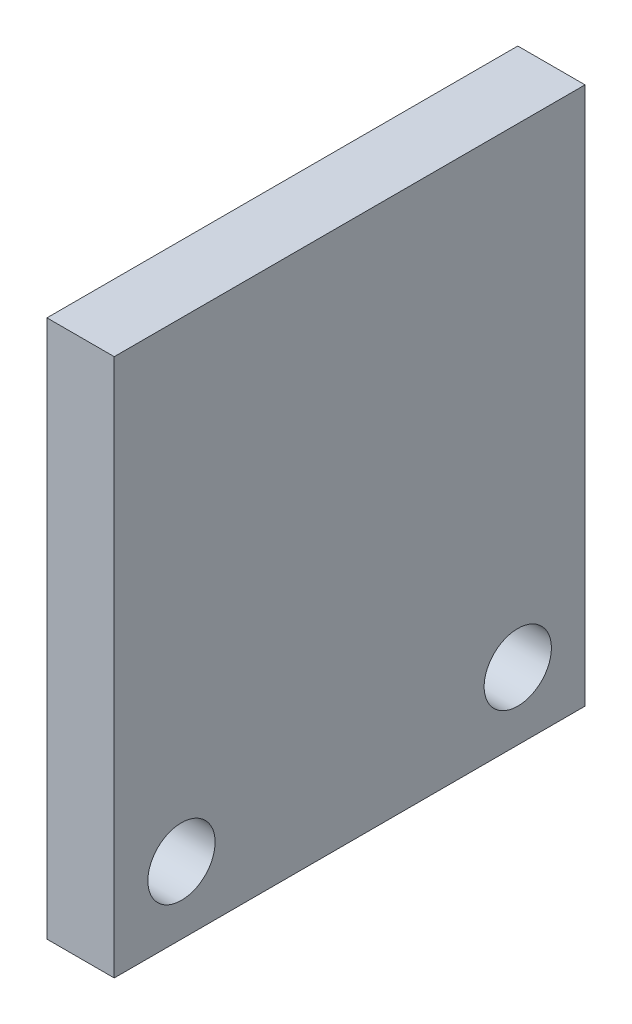
ISO-10303-21;
HEADER;
FILE_DESCRIPTION(('STEP AP214'),'2;1');
FILE_NAME('part.step','',(''),(''),'','','');
FILE_SCHEMA(('AUTOMOTIVE_DESIGN { 1 0 10303 214 1 1 1 1 }'));
ENDSEC;
DATA;
#1=APPLICATION_CONTEXT('core data for automotive mechanical design processes');
#2=APPLICATION_PROTOCOL_DEFINITION('international standard','automotive_design',2000,#1);
#3=PRODUCT_CONTEXT('',#1,'mechanical');
#4=PRODUCT('Part','Part','',(#3));
#5=PRODUCT_RELATED_PRODUCT_CATEGORY('part','',(#4));
#6=PRODUCT_DEFINITION_FORMATION('','',#4);
#7=PRODUCT_DEFINITION_CONTEXT('part definition',#1,'design');
#8=PRODUCT_DEFINITION('design','',#6,#7);
#9=PRODUCT_DEFINITION_SHAPE('','',#8);
#10=(LENGTH_UNIT() NAMED_UNIT(*) SI_UNIT(.MILLI.,.METRE.));
#11=(NAMED_UNIT(*) PLANE_ANGLE_UNIT() SI_UNIT($,.RADIAN.));
#12=(NAMED_UNIT(*) SI_UNIT($,.STERADIAN.) SOLID_ANGLE_UNIT());
#13=UNCERTAINTY_MEASURE_WITH_UNIT(LENGTH_MEASURE(1.E-05),#10,'distance_accuracy_value','');
#14=(GEOMETRIC_REPRESENTATION_CONTEXT(3) GLOBAL_UNCERTAINTY_ASSIGNED_CONTEXT((#13)) GLOBAL_UNIT_ASSIGNED_CONTEXT((#10,
#11,#12)) REPRESENTATION_CONTEXT('',''));
#15=CARTESIAN_POINT('',(0.,0.,0.));
#16=DIRECTION('',(0.,0.,1.));
#17=DIRECTION('',(1.,0.,0.));
#18=AXIS2_PLACEMENT_3D('',#15,#16,#17);
#19=CARTESIAN_POINT('',(5.,20.,-17.5));
#20=DIRECTION('',(0.,0.,1.));
#21=DIRECTION('',(0.,-1.,0.));
#22=AXIS2_PLACEMENT_3D('',#19,#20,#21);
#23=PLANE('',#22);
#24=DIRECTION('',(0.,1.,0.));
#25=VECTOR('',#24,1.);
#26=CARTESIAN_POINT('',(0.,20.,-17.5));
#27=LINE('',#26,#25);
#28=CARTESIAN_POINT('',(0.,-20.,-17.5));
#29=VERTEX_POINT('',#28);
#30=CARTESIAN_POINT('',(0.,20.,-17.5));
#31=VERTEX_POINT('',#30);
#32=EDGE_CURVE('E107',#29,#31,#27,.T.);
#33=ORIENTED_EDGE('',*,*,#32,.T.);
#34=DIRECTION('',(-1.,0.,0.));
#35=VECTOR('',#34,1.);
#36=CARTESIAN_POINT('',(5.,20.,-17.5));
#37=LINE('',#36,#35);
#38=CARTESIAN_POINT('',(5.,20.,-17.5));
#39=VERTEX_POINT('',#38);
#40=EDGE_CURVE('E11',#39,#31,#37,.T.);
#41=ORIENTED_EDGE('',*,*,#40,.F.);
#42=DIRECTION('',(0.,1.,0.));
#43=VECTOR('',#42,1.);
#44=CARTESIAN_POINT('',(5.,20.,-17.5));
#45=LINE('',#44,#43);
#46=CARTESIAN_POINT('',(5.,-20.,-17.5));
#47=VERTEX_POINT('',#46);
#48=EDGE_CURVE('E91',#47,#39,#45,.T.);
#49=ORIENTED_EDGE('',*,*,#48,.F.);
#50=DIRECTION('',(-1.,0.,0.));
#51=VECTOR('',#50,1.);
#52=CARTESIAN_POINT('',(5.,-20.,-17.5));
#53=LINE('',#52,#51);
#54=EDGE_CURVE('E103',#47,#29,#53,.T.);
#55=ORIENTED_EDGE('',*,*,#54,.T.);
#56=EDGE_LOOP('',(#33,#41,#49,#55));
#57=FACE_BOUND('',#56,.T.);
#58=ADVANCED_FACE('F39',(#57),#23,.F.);
#59=CARTESIAN_POINT('',(5.,20.,17.5));
#60=DIRECTION('',(0.,-1.,0.));
#61=DIRECTION('',(0.,0.,-1.));
#62=AXIS2_PLACEMENT_3D('',#59,#60,#61);
#63=PLANE('',#62);
#64=DIRECTION('',(0.,0.,1.));
#65=VECTOR('',#64,1.);
#66=CARTESIAN_POINT('',(0.,20.,17.5));
#67=LINE('',#66,#65);
#68=CARTESIAN_POINT('',(0.,20.,17.5));
#69=VERTEX_POINT('',#68);
#70=EDGE_CURVE('E96',#31,#69,#67,.T.);
#71=ORIENTED_EDGE('',*,*,#70,.T.);
#72=DIRECTION('',(-1.,0.,0.));
#73=VECTOR('',#72,1.);
#74=CARTESIAN_POINT('',(5.,20.,17.5));
#75=LINE('',#74,#73);
#76=CARTESIAN_POINT('',(5.,20.,17.5));
#77=VERTEX_POINT('',#76);
#78=EDGE_CURVE('E48',#77,#69,#75,.T.);
#79=ORIENTED_EDGE('',*,*,#78,.F.);
#80=DIRECTION('',(0.,0.,1.));
#81=VECTOR('',#80,1.);
#82=CARTESIAN_POINT('',(5.,20.,17.5));
#83=LINE('',#82,#81);
#84=EDGE_CURVE('E86',#39,#77,#83,.T.);
#85=ORIENTED_EDGE('',*,*,#84,.F.);
#86=ORIENTED_EDGE('',*,*,#40,.T.);
#87=EDGE_LOOP('',(#71,#79,#85,#86));
#88=FACE_BOUND('',#87,.T.);
#89=ADVANCED_FACE('F95',(#88),#63,.F.);
#90=CARTESIAN_POINT('',(5.,20.,17.5));
#91=DIRECTION('',(0.,0.,-1.));
#92=DIRECTION('',(0.,1.,0.));
#93=AXIS2_PLACEMENT_3D('',#90,#91,#92);
#94=PLANE('',#93);
#95=DIRECTION('',(0.,-1.,0.));
#96=VECTOR('',#95,1.);
#97=CARTESIAN_POINT('',(0.,20.,17.5));
#98=LINE('',#97,#96);
#99=CARTESIAN_POINT('',(0.,-20.,17.5));
#100=VERTEX_POINT('',#99);
#101=EDGE_CURVE('E73',#69,#100,#98,.T.);
#102=ORIENTED_EDGE('',*,*,#101,.T.);
#103=DIRECTION('',(-1.,0.,0.));
#104=VECTOR('',#103,1.);
#105=CARTESIAN_POINT('',(5.,-20.,17.5));
#106=LINE('',#105,#104);
#107=CARTESIAN_POINT('',(5.,-20.,17.5));
#108=VERTEX_POINT('',#107);
#109=EDGE_CURVE('E98',#108,#100,#106,.T.);
#110=ORIENTED_EDGE('',*,*,#109,.F.);
#111=DIRECTION('',(0.,-1.,0.));
#112=VECTOR('',#111,1.);
#113=CARTESIAN_POINT('',(5.,20.,17.5));
#114=LINE('',#113,#112);
#115=EDGE_CURVE('E89',#77,#108,#114,.T.);
#116=ORIENTED_EDGE('',*,*,#115,.F.);
#117=ORIENTED_EDGE('',*,*,#78,.T.);
#118=EDGE_LOOP('',(#102,#110,#116,#117));
#119=FACE_BOUND('',#118,.T.);
#120=ADVANCED_FACE('F99',(#119),#94,.F.);
#121=CARTESIAN_POINT('',(5.,-20.,17.5));
#122=DIRECTION('',(0.,1.,0.));
#123=DIRECTION('',(0.,0.,1.));
#124=AXIS2_PLACEMENT_3D('',#121,#122,#123);
#125=PLANE('',#124);
#126=DIRECTION('',(0.,0.,-1.));
#127=VECTOR('',#126,1.);
#128=CARTESIAN_POINT('',(0.,-20.,17.5));
#129=LINE('',#128,#127);
#130=EDGE_CURVE('E79',#100,#29,#129,.T.);
#131=ORIENTED_EDGE('',*,*,#130,.T.);
#132=ORIENTED_EDGE('',*,*,#54,.F.);
#133=DIRECTION('',(0.,0.,-1.));
#134=VECTOR('',#133,1.);
#135=CARTESIAN_POINT('',(5.,-20.,17.5));
#136=LINE('',#135,#134);
#137=EDGE_CURVE('E56',#108,#47,#136,.T.);
#138=ORIENTED_EDGE('',*,*,#137,.F.);
#139=ORIENTED_EDGE('',*,*,#109,.T.);
#140=EDGE_LOOP('',(#131,#132,#138,#139));
#141=FACE_BOUND('',#140,.T.);
#142=ADVANCED_FACE('F121',(#141),#125,.F.);
#143=CARTESIAN_POINT('',(5.,0.,0.));
#144=DIRECTION('',(1.,0.,0.));
#145=DIRECTION('',(0.,0.,-1.));
#146=AXIS2_PLACEMENT_3D('',#143,#144,#145);
#147=PLANE('',#146);
#148=CARTESIAN_POINT('',(5.,-15.,12.5));
#149=DIRECTION('',(1.,0.,0.));
#150=DIRECTION('',(0.,0.,-1.));
#151=AXIS2_PLACEMENT_3D('',#148,#149,#150);
#152=CIRCLE('',#151,2.5);
#153=CARTESIAN_POINT('',(5.,-15.,10.));
#154=VERTEX_POINT('',#153);
#155=EDGE_CURVE('E136',#154,#154,#152,.T.);
#156=ORIENTED_EDGE('',*,*,#155,.F.);
#157=EDGE_LOOP('',(#156));
#158=FACE_BOUND('',#157,.T.);
#159=CARTESIAN_POINT('',(5.,-15.,-12.5));
#160=DIRECTION('',(1.,0.,0.));
#161=DIRECTION('',(0.,0.,-1.));
#162=AXIS2_PLACEMENT_3D('',#159,#160,#161);
#163=CIRCLE('',#162,2.5);
#164=CARTESIAN_POINT('',(5.,-15.,-15.));
#165=VERTEX_POINT('',#164);
#166=EDGE_CURVE('E128',#165,#165,#163,.T.);
#167=ORIENTED_EDGE('',*,*,#166,.F.);
#168=EDGE_LOOP('',(#167));
#169=FACE_BOUND('',#168,.T.);
#170=ORIENTED_EDGE('',*,*,#48,.T.);
#171=ORIENTED_EDGE('',*,*,#84,.T.);
#172=ORIENTED_EDGE('',*,*,#115,.T.);
#173=ORIENTED_EDGE('',*,*,#137,.T.);
#174=EDGE_LOOP('',(#170,#171,#172,#173));
#175=FACE_BOUND('',#174,.T.);
#176=ADVANCED_FACE('F87',(#158,#169,#175),#147,.T.);
#177=CARTESIAN_POINT('',(0.,0.,0.));
#178=DIRECTION('',(1.,0.,0.));
#179=DIRECTION('',(0.,0.,-1.));
#180=AXIS2_PLACEMENT_3D('',#177,#178,#179);
#181=PLANE('',#180);
#182=CARTESIAN_POINT('',(0.,-15.,12.5));
#183=DIRECTION('',(1.,0.,0.));
#184=DIRECTION('',(0.,0.,-1.));
#185=AXIS2_PLACEMENT_3D('',#182,#183,#184);
#186=CIRCLE('',#185,2.5);
#187=CARTESIAN_POINT('',(0.,-15.,10.));
#188=VERTEX_POINT('',#187);
#189=EDGE_CURVE('E111',#188,#188,#186,.T.);
#190=ORIENTED_EDGE('',*,*,#189,.T.);
#191=EDGE_LOOP('',(#190));
#192=FACE_BOUND('',#191,.T.);
#193=CARTESIAN_POINT('',(0.,-15.,-12.5));
#194=DIRECTION('',(1.,0.,0.));
#195=DIRECTION('',(0.,0.,-1.));
#196=AXIS2_PLACEMENT_3D('',#193,#194,#195);
#197=CIRCLE('',#196,2.5);
#198=CARTESIAN_POINT('',(0.,-15.,-15.));
#199=VERTEX_POINT('',#198);
#200=EDGE_CURVE('E132',#199,#199,#197,.T.);
#201=ORIENTED_EDGE('',*,*,#200,.T.);
#202=EDGE_LOOP('',(#201));
#203=FACE_BOUND('',#202,.T.);
#204=ORIENTED_EDGE('',*,*,#32,.F.);
#205=ORIENTED_EDGE('',*,*,#130,.F.);
#206=ORIENTED_EDGE('',*,*,#101,.F.);
#207=ORIENTED_EDGE('',*,*,#70,.F.);
#208=EDGE_LOOP('',(#204,#205,#206,#207));
#209=FACE_BOUND('',#208,.T.);
#210=ADVANCED_FACE('F124',(#192,#203,#209),#181,.F.);
#211=CARTESIAN_POINT('',(0.,-15.,-12.5));
#212=DIRECTION('',(1.,0.,0.));
#213=DIRECTION('',(0.,0.,-1.));
#214=AXIS2_PLACEMENT_3D('',#211,#212,#213);
#215=CYLINDRICAL_SURFACE('',#214,2.5);
#216=ORIENTED_EDGE('',*,*,#200,.F.);
#217=EDGE_LOOP('',(#216));
#218=FACE_BOUND('',#217,.T.);
#219=ORIENTED_EDGE('',*,*,#166,.T.);
#220=EDGE_LOOP('',(#219));
#221=FACE_BOUND('',#220,.T.);
#222=ADVANCED_FACE('F149',(#218,#221),#215,.F.);
#223=CARTESIAN_POINT('',(0.,-15.,12.5));
#224=DIRECTION('',(1.,0.,0.));
#225=DIRECTION('',(0.,0.,-1.));
#226=AXIS2_PLACEMENT_3D('',#223,#224,#225);
#227=CYLINDRICAL_SURFACE('',#226,2.5);
#228=ORIENTED_EDGE('',*,*,#189,.F.);
#229=EDGE_LOOP('',(#228));
#230=FACE_BOUND('',#229,.T.);
#231=ORIENTED_EDGE('',*,*,#155,.T.);
#232=EDGE_LOOP('',(#231));
#233=FACE_BOUND('',#232,.T.);
#234=ADVANCED_FACE('F146',(#230,#233),#227,.F.);
#235=CLOSED_SHELL('',(#58,#89,#120,#142,#176,#210,#222,#234));
#236=MANIFOLD_SOLID_BREP('B2',#235);
#237=ADVANCED_BREP_SHAPE_REPRESENTATION('',(#18,#236),#14);
#238=SHAPE_DEFINITION_REPRESENTATION(#9,#237);
ENDSEC;
END-ISO-10303-21;
